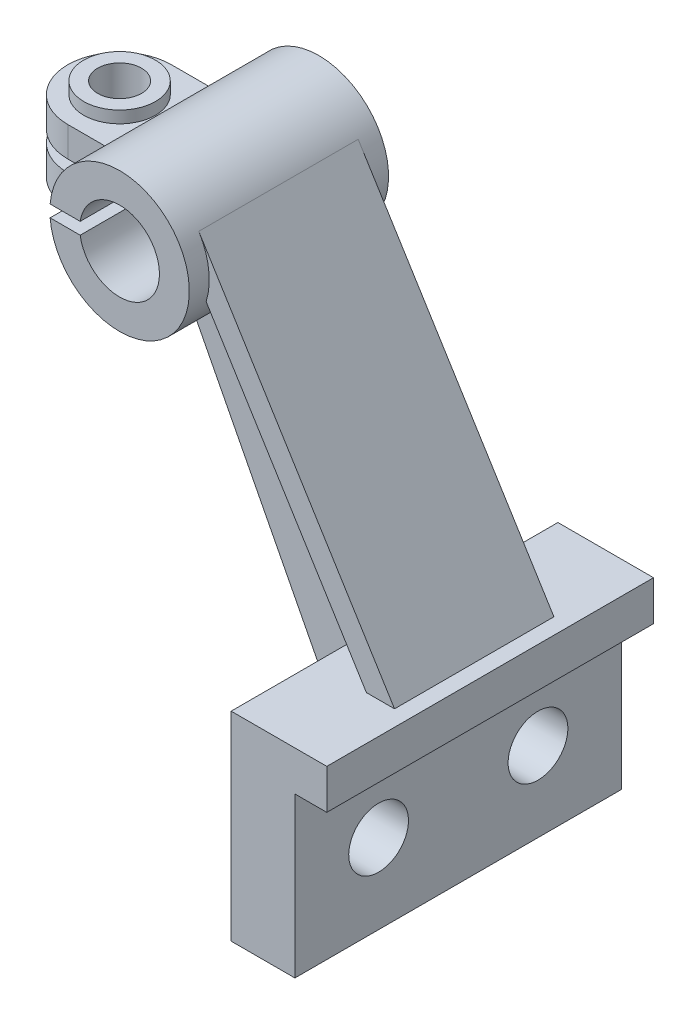
ISO-10303-21;
HEADER;
FILE_DESCRIPTION(('STEP AP214'),'2;1');
FILE_NAME('part.step','',(''),(''),'','','');
FILE_SCHEMA(('AUTOMOTIVE_DESIGN { 1 0 10303 214 1 1 1 1 }'));
ENDSEC;
DATA;
#1=APPLICATION_CONTEXT('core data for automotive mechanical design processes');
#2=APPLICATION_PROTOCOL_DEFINITION('international standard','automotive_design',2000,#1);
#3=PRODUCT_CONTEXT('',#1,'mechanical');
#4=PRODUCT('Part','Part','',(#3));
#5=PRODUCT_RELATED_PRODUCT_CATEGORY('part','',(#4));
#6=PRODUCT_DEFINITION_FORMATION('','',#4);
#7=PRODUCT_DEFINITION_CONTEXT('part definition',#1,'design');
#8=PRODUCT_DEFINITION('design','',#6,#7);
#9=PRODUCT_DEFINITION_SHAPE('','',#8);
#10=(LENGTH_UNIT() NAMED_UNIT(*) SI_UNIT(.MILLI.,.METRE.));
#11=(NAMED_UNIT(*) PLANE_ANGLE_UNIT() SI_UNIT($,.RADIAN.));
#12=(NAMED_UNIT(*) SI_UNIT($,.STERADIAN.) SOLID_ANGLE_UNIT());
#13=UNCERTAINTY_MEASURE_WITH_UNIT(LENGTH_MEASURE(1.E-05),#10,'distance_accuracy_value','');
#14=(GEOMETRIC_REPRESENTATION_CONTEXT(3) GLOBAL_UNCERTAINTY_ASSIGNED_CONTEXT((#13)) GLOBAL_UNIT_ASSIGNED_CONTEXT((#10,
#11,#12)) REPRESENTATION_CONTEXT('',''));
#15=CARTESIAN_POINT('',(0.,0.,0.));
#16=DIRECTION('',(0.,0.,1.));
#17=DIRECTION('',(1.,0.,0.));
#18=AXIS2_PLACEMENT_3D('',#15,#16,#17);
#19=CARTESIAN_POINT('',(0.,0.,4.));
#20=DIRECTION('',(0.,0.,1.));
#21=DIRECTION('',(1.,0.,0.));
#22=AXIS2_PLACEMENT_3D('',#19,#20,#21);
#23=PLANE('',#22);
#24=DIRECTION('',(1.,0.,0.));
#25=VECTOR('',#24,1.);
#26=CARTESIAN_POINT('',(44.,-70.,4.));
#27=LINE('',#26,#25);
#28=CARTESIAN_POINT('',(44.,-70.,4.));
#29=VERTEX_POINT('',#28);
#30=CARTESIAN_POINT('',(56.939992816439,-70.,4.));
#31=VERTEX_POINT('',#30);
#32=EDGE_CURVE('E370',#29,#31,#27,.T.);
#33=ORIENTED_EDGE('',*,*,#32,.T.);
#34=DIRECTION('',(-0.527012564305545,0.84985749220919,0.));
#35=VECTOR('',#34,1.);
#36=CARTESIAN_POINT('',(9.7733611604057,6.06064448951377,4.));
#37=LINE('',#36,#35);
#38=CARTESIAN_POINT('',(16.7251343349884,-5.14974576815132,4.));
#39=VERTEX_POINT('',#38);
#40=EDGE_CURVE('E287',#31,#39,#37,.T.);
#41=ORIENTED_EDGE('',*,*,#40,.T.);
#42=CARTESIAN_POINT('',(0.,0.,4.));
#43=DIRECTION('',(0.,0.,-1.));
#44=DIRECTION('',(1.,0.,0.));
#45=AXIS2_PLACEMENT_3D('',#42,#43,#44);
#46=CIRCLE('',#45,17.5);
#47=CARTESIAN_POINT('',(-7.,-16.0390149323454,4.));
#48=VERTEX_POINT('',#47);
#49=EDGE_CURVE('E360',#39,#48,#46,.T.);
#50=ORIENTED_EDGE('',*,*,#49,.T.);
#51=DIRECTION('',(0.458099254186981,-0.88890104810003,0.));
#52=VECTOR('',#51,1.);
#53=CARTESIAN_POINT('',(-7.,-16.0390149323454,4.));
#54=LINE('',#53,#52);
#55=CARTESIAN_POINT('',(44.,-115.,4.));
#56=VERTEX_POINT('',#55);
#57=EDGE_CURVE('E363',#48,#56,#54,.T.);
#58=ORIENTED_EDGE('',*,*,#57,.T.);
#59=DIRECTION('',(0.,1.,0.));
#60=VECTOR('',#59,1.);
#61=CARTESIAN_POINT('',(44.,-115.,4.));
#62=LINE('',#61,#60);
#63=EDGE_CURVE('E367',#56,#29,#62,.T.);
#64=ORIENTED_EDGE('',*,*,#63,.T.);
#65=EDGE_LOOP('',(#33,#41,#50,#58,#64));
#66=FACE_BOUND('',#65,.T.);
#67=ADVANCED_FACE('F49',(#66),#23,.T.);
#68=CARTESIAN_POINT('',(0.,0.,-4.));
#69=DIRECTION('',(0.,0.,1.));
#70=DIRECTION('',(1.,0.,0.));
#71=AXIS2_PLACEMENT_3D('',#68,#69,#70);
#72=PLANE('',#71);
#73=DIRECTION('',(-0.527012564305545,0.84985749220919,0.));
#74=VECTOR('',#73,1.);
#75=CARTESIAN_POINT('',(9.7733611604057,6.06064448951377,-4.));
#76=LINE('',#75,#74);
#77=CARTESIAN_POINT('',(56.939992816439,-70.,-4.));
#78=VERTEX_POINT('',#77);
#79=CARTESIAN_POINT('',(16.7251343349884,-5.14974576815131,-4.));
#80=VERTEX_POINT('',#79);
#81=EDGE_CURVE('E283',#78,#80,#76,.T.);
#82=ORIENTED_EDGE('',*,*,#81,.F.);
#83=DIRECTION('',(1.,0.,0.));
#84=VECTOR('',#83,1.);
#85=CARTESIAN_POINT('',(44.,-70.,-4.));
#86=LINE('',#85,#84);
#87=CARTESIAN_POINT('',(44.,-70.,-4.));
#88=VERTEX_POINT('',#87);
#89=EDGE_CURVE('E364',#88,#78,#86,.T.);
#90=ORIENTED_EDGE('',*,*,#89,.F.);
#91=DIRECTION('',(0.,1.,0.));
#92=VECTOR('',#91,1.);
#93=CARTESIAN_POINT('',(44.,-115.,-4.));
#94=LINE('',#93,#92);
#95=CARTESIAN_POINT('',(44.,-115.,-4.));
#96=VERTEX_POINT('',#95);
#97=EDGE_CURVE('E379',#96,#88,#94,.T.);
#98=ORIENTED_EDGE('',*,*,#97,.F.);
#99=DIRECTION('',(0.458099254186981,-0.88890104810003,0.));
#100=VECTOR('',#99,1.);
#101=CARTESIAN_POINT('',(-7.,-16.0390149323454,-4.));
#102=LINE('',#101,#100);
#103=CARTESIAN_POINT('',(-7.,-16.0390149323454,-4.));
#104=VERTEX_POINT('',#103);
#105=EDGE_CURVE('E376',#104,#96,#102,.T.);
#106=ORIENTED_EDGE('',*,*,#105,.F.);
#107=CARTESIAN_POINT('',(0.,0.,-4.));
#108=DIRECTION('',(0.,0.,-1.));
#109=DIRECTION('',(1.,0.,0.));
#110=AXIS2_PLACEMENT_3D('',#107,#108,#109);
#111=CIRCLE('',#110,17.5);
#112=EDGE_CURVE('E359',#80,#104,#111,.T.);
#113=ORIENTED_EDGE('',*,*,#112,.F.);
#114=EDGE_LOOP('',(#82,#90,#98,#106,#113));
#115=FACE_BOUND('',#114,.T.);
#116=ADVANCED_FACE('F595',(#115),#72,.F.);
#117=CARTESIAN_POINT('',(44.,-70.,41.));
#118=DIRECTION('',(0.,-1.,0.));
#119=DIRECTION('',(0.,0.,-1.));
#120=AXIS2_PLACEMENT_3D('',#117,#118,#119);
#121=PLANE('',#120);
#122=DIRECTION('',(0.,0.,-1.));
#123=VECTOR('',#122,1.);
#124=CARTESIAN_POINT('',(64.,-70.,4.));
#125=LINE('',#124,#123);
#126=CARTESIAN_POINT('',(64.,-70.,20.));
#127=VERTEX_POINT('',#126);
#128=CARTESIAN_POINT('',(64.,-70.,-20.));
#129=VERTEX_POINT('',#128);
#130=EDGE_CURVE('E230',#127,#129,#125,.T.);
#131=ORIENTED_EDGE('',*,*,#130,.F.);
#132=DIRECTION('',(1.,0.,0.));
#133=VECTOR('',#132,1.);
#134=CARTESIAN_POINT('',(64.,-70.,20.));
#135=LINE('',#134,#133);
#136=CARTESIAN_POINT('',(56.939992816439,-70.,20.));
#137=VERTEX_POINT('',#136);
#138=EDGE_CURVE('E235',#137,#127,#135,.T.);
#139=ORIENTED_EDGE('',*,*,#138,.F.);
#140=DIRECTION('',(0.,0.,-1.));
#141=VECTOR('',#140,1.);
#142=CARTESIAN_POINT('',(56.939992816439,-70.,20.));
#143=LINE('',#142,#141);
#144=EDGE_CURVE('E268',#137,#31,#143,.T.);
#145=ORIENTED_EDGE('',*,*,#144,.T.);
#146=ORIENTED_EDGE('',*,*,#32,.F.);
#147=DIRECTION('',(0.,0.,-1.));
#148=VECTOR('',#147,1.);
#149=CARTESIAN_POINT('',(44.,-70.,41.));
#150=LINE('',#149,#148);
#151=CARTESIAN_POINT('',(44.,-70.,41.));
#152=VERTEX_POINT('',#151);
#153=EDGE_CURVE('E347',#152,#29,#150,.T.);
#154=ORIENTED_EDGE('',*,*,#153,.F.);
#155=DIRECTION('',(-1.,0.,0.));
#156=VECTOR('',#155,1.);
#157=CARTESIAN_POINT('',(44.,-70.,41.));
#158=LINE('',#157,#156);
#159=CARTESIAN_POINT('',(68.,-70.,41.));
#160=VERTEX_POINT('',#159);
#161=EDGE_CURVE('E331',#160,#152,#158,.T.);
#162=ORIENTED_EDGE('',*,*,#161,.F.);
#163=DIRECTION('',(0.,0.,1.));
#164=VECTOR('',#163,1.);
#165=CARTESIAN_POINT('',(68.,-70.,41.));
#166=LINE('',#165,#164);
#167=CARTESIAN_POINT('',(68.,-70.,-41.));
#168=VERTEX_POINT('',#167);
#169=EDGE_CURVE('E303',#168,#160,#166,.T.);
#170=ORIENTED_EDGE('',*,*,#169,.F.);
#171=DIRECTION('',(-1.,0.,0.));
#172=VECTOR('',#171,1.);
#173=CARTESIAN_POINT('',(44.,-70.,-41.));
#174=LINE('',#173,#172);
#175=CARTESIAN_POINT('',(44.,-70.,-41.));
#176=VERTEX_POINT('',#175);
#177=EDGE_CURVE('E324',#168,#176,#174,.T.);
#178=ORIENTED_EDGE('',*,*,#177,.T.);
#179=EDGE_CURVE('E334',#88,#176,#150,.T.);
#180=ORIENTED_EDGE('',*,*,#179,.F.);
#181=ORIENTED_EDGE('',*,*,#89,.T.);
#182=DIRECTION('',(0.,0.,1.));
#183=VECTOR('',#182,1.);
#184=CARTESIAN_POINT('',(56.939992816439,-70.,41.));
#185=LINE('',#184,#183);
#186=CARTESIAN_POINT('',(56.939992816439,-70.,-20.));
#187=VERTEX_POINT('',#186);
#188=EDGE_CURVE('E11',#187,#78,#185,.T.);
#189=ORIENTED_EDGE('',*,*,#188,.F.);
#190=DIRECTION('',(1.,0.,0.));
#191=VECTOR('',#190,1.);
#192=CARTESIAN_POINT('',(64.,-70.,-20.));
#193=LINE('',#192,#191);
#194=EDGE_CURVE('E237',#187,#129,#193,.T.);
#195=ORIENTED_EDGE('',*,*,#194,.T.);
#196=EDGE_LOOP('',(#131,#139,#145,#146,#154,#162,#170,#178,#180,#181,#189,#195));
#197=FACE_BOUND('',#196,.T.);
#198=ADVANCED_FACE('F232',(#197),#121,.F.);
#199=CARTESIAN_POINT('',(0.,9.,-13.));
#200=DIRECTION('',(0.,0.,1.));
#201=DIRECTION('',(1.,0.,0.));
#202=AXIS2_PLACEMENT_3D('',#199,#200,#201);
#203=PLANE('',#202);
#204=DIRECTION('',(0.,-1.,0.));
#205=VECTOR('',#204,1.);
#206=CARTESIAN_POINT('',(-25.,9.,-13.));
#207=LINE('',#206,#205);
#208=CARTESIAN_POINT('',(-25.,-1.5,-13.));
#209=VERTEX_POINT('',#208);
#210=CARTESIAN_POINT('',(-25.,-9.,-13.));
#211=VERTEX_POINT('',#210);
#212=EDGE_CURVE('E497',#209,#211,#207,.T.);
#213=ORIENTED_EDGE('',*,*,#212,.F.);
#214=DIRECTION('',(1.,0.,0.));
#215=VECTOR('',#214,1.);
#216=CARTESIAN_POINT('',(0.,-1.5,-13.));
#217=LINE('',#216,#215);
#218=CARTESIAN_POINT('',(-17.4355957741627,-1.5,-13.));
#219=VERTEX_POINT('',#218);
#220=EDGE_CURVE('E453',#209,#219,#217,.T.);
#221=ORIENTED_EDGE('',*,*,#220,.T.);
#222=CARTESIAN_POINT('',(0.,0.,-13.));
#223=DIRECTION('',(0.,0.,1.));
#224=DIRECTION('',(1.,0.,0.));
#225=AXIS2_PLACEMENT_3D('',#222,#223,#224);
#226=CIRCLE('',#225,17.5);
#227=CARTESIAN_POINT('',(-15.0083310198036,-9.,-13.));
#228=VERTEX_POINT('',#227);
#229=EDGE_CURVE('E519',#219,#228,#226,.T.);
#230=ORIENTED_EDGE('',*,*,#229,.T.);
#231=DIRECTION('',(-1.,0.,0.));
#232=VECTOR('',#231,1.);
#233=CARTESIAN_POINT('',(0.,-9.,-13.));
#234=LINE('',#233,#232);
#235=EDGE_CURVE('E466',#228,#211,#234,.T.);
#236=ORIENTED_EDGE('',*,*,#235,.T.);
#237=EDGE_LOOP('',(#213,#221,#230,#236));
#238=FACE_BOUND('',#237,.T.);
#239=ADVANCED_FACE('F681',(#238),#203,.F.);
#240=CARTESIAN_POINT('',(-25.,9.,0.));
#241=DIRECTION('',(0.,-1.,0.));
#242=DIRECTION('',(0.,0.,-1.));
#243=AXIS2_PLACEMENT_3D('',#240,#241,#242);
#244=CYLINDRICAL_SURFACE('',#243,13.);
#245=DIRECTION('',(0.,-1.,0.));
#246=VECTOR('',#245,1.);
#247=CARTESIAN_POINT('',(-25.,9.,13.));
#248=LINE('',#247,#246);
#249=CARTESIAN_POINT('',(-25.,-1.5,13.));
#250=VERTEX_POINT('',#249);
#251=CARTESIAN_POINT('',(-25.,-9.,13.));
#252=VERTEX_POINT('',#251);
#253=EDGE_CURVE('E482',#250,#252,#248,.T.);
#254=ORIENTED_EDGE('',*,*,#253,.F.);
#255=CARTESIAN_POINT('',(-25.,-1.5,0.));
#256=DIRECTION('',(0.,-1.,0.));
#257=DIRECTION('',(0.,0.,-1.));
#258=AXIS2_PLACEMENT_3D('',#255,#256,#257);
#259=CIRCLE('',#258,13.);
#260=EDGE_CURVE('E449',#250,#209,#259,.T.);
#261=ORIENTED_EDGE('',*,*,#260,.T.);
#262=ORIENTED_EDGE('',*,*,#212,.T.);
#263=CARTESIAN_POINT('',(-25.,-9.,0.));
#264=DIRECTION('',(0.,1.,0.));
#265=DIRECTION('',(0.,0.,1.));
#266=AXIS2_PLACEMENT_3D('',#263,#264,#265);
#267=CIRCLE('',#266,13.);
#268=EDGE_CURVE('E486',#211,#252,#267,.T.);
#269=ORIENTED_EDGE('',*,*,#268,.T.);
#270=EDGE_LOOP('',(#254,#261,#262,#269));
#271=FACE_BOUND('',#270,.T.);
#272=ADVANCED_FACE('F677',(#271),#244,.T.);
#273=CARTESIAN_POINT('',(0.,9.,13.));
#274=DIRECTION('',(0.,0.,-1.));
#275=DIRECTION('',(-1.,0.,0.));
#276=AXIS2_PLACEMENT_3D('',#273,#274,#275);
#277=PLANE('',#276);
#278=CARTESIAN_POINT('',(0.,0.,13.));
#279=DIRECTION('',(0.,0.,-1.));
#280=DIRECTION('',(-1.,0.,0.));
#281=AXIS2_PLACEMENT_3D('',#278,#279,#280);
#282=CIRCLE('',#281,17.5);
#283=CARTESIAN_POINT('',(-15.0083310198036,-9.,13.));
#284=VERTEX_POINT('',#283);
#285=CARTESIAN_POINT('',(-17.4355957741627,-1.5,13.));
#286=VERTEX_POINT('',#285);
#287=EDGE_CURVE('E515',#284,#286,#282,.T.);
#288=ORIENTED_EDGE('',*,*,#287,.T.);
#289=DIRECTION('',(-1.,0.,0.));
#290=VECTOR('',#289,1.);
#291=CARTESIAN_POINT('',(0.,-1.5,13.));
#292=LINE('',#291,#290);
#293=EDGE_CURVE('E532',#286,#250,#292,.T.);
#294=ORIENTED_EDGE('',*,*,#293,.T.);
#295=ORIENTED_EDGE('',*,*,#253,.T.);
#296=DIRECTION('',(1.,0.,0.));
#297=VECTOR('',#296,1.);
#298=CARTESIAN_POINT('',(0.,-9.,13.));
#299=LINE('',#298,#297);
#300=EDGE_CURVE('E475',#252,#284,#299,.T.);
#301=ORIENTED_EDGE('',*,*,#300,.T.);
#302=EDGE_LOOP('',(#288,#294,#295,#301));
#303=FACE_BOUND('',#302,.T.);
#304=ADVANCED_FACE('F673',(#303),#277,.F.);
#305=CARTESIAN_POINT('',(0.,0.,25.));
#306=DIRECTION('',(0.,0.,-1.));
#307=DIRECTION('',(-1.,0.,0.));
#308=AXIS2_PLACEMENT_3D('',#305,#306,#307);
#309=CYLINDRICAL_SURFACE('',#308,17.5);
#310=CARTESIAN_POINT('',(0.,0.,20.));
#311=DIRECTION('',(0.,0.,-1.));
#312=DIRECTION('',(1.,0.,0.));
#313=AXIS2_PLACEMENT_3D('',#310,#311,#312);
#314=CIRCLE('',#313,17.5);
#315=CARTESIAN_POINT('',(14.8725061136608,9.22271987534704,20.));
#316=VERTEX_POINT('',#315);
#317=CARTESIAN_POINT('',(16.7251343349884,-5.14974576815132,20.));
#318=VERTEX_POINT('',#317);
#319=EDGE_CURVE('E248',#316,#318,#314,.T.);
#320=ORIENTED_EDGE('',*,*,#319,.F.);
#321=DIRECTION('',(0.,0.,-1.));
#322=VECTOR('',#321,1.);
#323=CARTESIAN_POINT('',(14.8725061136608,9.22271987534704,4.));
#324=LINE('',#323,#322);
#325=CARTESIAN_POINT('',(14.8725061136608,9.22271987534704,-20.));
#326=VERTEX_POINT('',#325);
#327=EDGE_CURVE('E67',#316,#326,#324,.T.);
#328=ORIENTED_EDGE('',*,*,#327,.T.);
#329=CARTESIAN_POINT('',(0.,0.,-20.));
#330=DIRECTION('',(0.,0.,-1.));
#331=DIRECTION('',(1.,0.,0.));
#332=AXIS2_PLACEMENT_3D('',#329,#330,#331);
#333=CIRCLE('',#332,17.5);
#334=CARTESIAN_POINT('',(16.7251343349884,-5.14974576815131,-20.));
#335=VERTEX_POINT('',#334);
#336=EDGE_CURVE('E72',#326,#335,#333,.T.);
#337=ORIENTED_EDGE('',*,*,#336,.T.);
#338=DIRECTION('',(0.,0.,-1.));
#339=VECTOR('',#338,1.);
#340=CARTESIAN_POINT('',(16.7251343349884,-5.14974576815132,20.));
#341=LINE('',#340,#339);
#342=EDGE_CURVE('E279',#80,#335,#341,.T.);
#343=ORIENTED_EDGE('',*,*,#342,.F.);
#344=ORIENTED_EDGE('',*,*,#112,.T.);
#345=DIRECTION('',(0.,0.,-1.));
#346=VECTOR('',#345,1.);
#347=CARTESIAN_POINT('',(-7.,-16.0390149323454,4.));
#348=LINE('',#347,#346);
#349=EDGE_CURVE('E391',#48,#104,#348,.T.);
#350=ORIENTED_EDGE('',*,*,#349,.F.);
#351=ORIENTED_EDGE('',*,*,#49,.F.);
#352=EDGE_CURVE('E280',#318,#39,#341,.T.);
#353=ORIENTED_EDGE('',*,*,#352,.F.);
#354=EDGE_LOOP('',(#320,#328,#337,#343,#344,#350,#351,#353));
#355=FACE_BOUND('',#354,.T.);
#356=CARTESIAN_POINT('',(0.,0.,25.));
#357=DIRECTION('',(0.,0.,1.));
#358=DIRECTION('',(1.,0.,0.));
#359=AXIS2_PLACEMENT_3D('',#356,#357,#358);
#360=CIRCLE('',#359,17.5);
#361=CARTESIAN_POINT('',(-17.4355957741627,-1.5,25.));
#362=VERTEX_POINT('',#361);
#363=CARTESIAN_POINT('',(-17.4355957741627,1.5,25.));
#364=VERTEX_POINT('',#363);
#365=EDGE_CURVE('E503',#362,#364,#360,.T.);
#366=ORIENTED_EDGE('',*,*,#365,.F.);
#367=DIRECTION('',(0.,0.,-1.));
#368=VECTOR('',#367,1.);
#369=CARTESIAN_POINT('',(-17.4355957741627,-1.5,25.));
#370=LINE('',#369,#368);
#371=EDGE_CURVE('E461',#362,#286,#370,.T.);
#372=ORIENTED_EDGE('',*,*,#371,.T.);
#373=ORIENTED_EDGE('',*,*,#287,.F.);
#374=DIRECTION('',(0.,0.,-1.));
#375=VECTOR('',#374,1.);
#376=CARTESIAN_POINT('',(-15.0083310198036,-9.,25.));
#377=LINE('',#376,#375);
#378=EDGE_CURVE('E507',#228,#284,#377,.F.);
#379=ORIENTED_EDGE('',*,*,#378,.F.);
#380=ORIENTED_EDGE('',*,*,#229,.F.);
#381=CARTESIAN_POINT('',(-17.4355957741627,-1.5,-25.));
#382=VERTEX_POINT('',#381);
#383=EDGE_CURVE('E457',#219,#382,#370,.T.);
#384=ORIENTED_EDGE('',*,*,#383,.T.);
#385=CARTESIAN_POINT('',(0.,0.,-25.));
#386=DIRECTION('',(0.,0.,1.));
#387=DIRECTION('',(1.,0.,0.));
#388=AXIS2_PLACEMENT_3D('',#385,#386,#387);
#389=CIRCLE('',#388,17.5);
#390=CARTESIAN_POINT('',(-17.4355957741627,1.5,-25.));
#391=VERTEX_POINT('',#390);
#392=EDGE_CURVE('E502',#382,#391,#389,.T.);
#393=ORIENTED_EDGE('',*,*,#392,.T.);
#394=DIRECTION('',(0.,0.,-1.));
#395=VECTOR('',#394,1.);
#396=CARTESIAN_POINT('',(-17.4355957741627,1.5,25.));
#397=LINE('',#396,#395);
#398=CARTESIAN_POINT('',(-17.4355957741627,1.5,-13.));
#399=VERTEX_POINT('',#398);
#400=EDGE_CURVE('E448',#391,#399,#397,.F.);
#401=ORIENTED_EDGE('',*,*,#400,.T.);
#402=CARTESIAN_POINT('',(-15.0083310198036,9.,-13.));
#403=VERTEX_POINT('',#402);
#404=EDGE_CURVE('E520',#403,#399,#226,.T.);
#405=ORIENTED_EDGE('',*,*,#404,.F.);
#406=DIRECTION('',(0.,0.,-1.));
#407=VECTOR('',#406,1.);
#408=CARTESIAN_POINT('',(-15.0083310198036,9.,25.));
#409=LINE('',#408,#407);
#410=CARTESIAN_POINT('',(-15.0083310198036,9.,13.));
#411=VERTEX_POINT('',#410);
#412=EDGE_CURVE('E524',#403,#411,#409,.F.);
#413=ORIENTED_EDGE('',*,*,#412,.T.);
#414=CARTESIAN_POINT('',(-17.4355957741627,1.5,13.));
#415=VERTEX_POINT('',#414);
#416=EDGE_CURVE('E514',#415,#411,#282,.T.);
#417=ORIENTED_EDGE('',*,*,#416,.F.);
#418=EDGE_CURVE('E444',#415,#364,#397,.F.);
#419=ORIENTED_EDGE('',*,*,#418,.T.);
#420=EDGE_LOOP('',(#366,#372,#373,#379,#380,#384,#393,#401,#405,#413,#417,#419));
#421=FACE_BOUND('',#420,.T.);
#422=ADVANCED_FACE('F51',(#355,#421),#309,.T.);
#423=CARTESIAN_POINT('',(0.,0.,25.));
#424=DIRECTION('',(0.,0.,1.));
#425=DIRECTION('',(1.,0.,0.));
#426=AXIS2_PLACEMENT_3D('',#423,#424,#425);
#427=PLANE('',#426);
#428=CARTESIAN_POINT('',(0.,0.,25.));
#429=DIRECTION('',(0.,0.,1.));
#430=DIRECTION('',(1.,0.,0.));
#431=AXIS2_PLACEMENT_3D('',#428,#429,#430);
#432=CIRCLE('',#431,10.);
#433=CARTESIAN_POINT('',(-9.88685996664259,-1.5,25.));
#434=VERTEX_POINT('',#433);
#435=CARTESIAN_POINT('',(-9.88685996664259,1.5,25.));
#436=VERTEX_POINT('',#435);
#437=EDGE_CURVE('E415',#434,#436,#432,.T.);
#438=ORIENTED_EDGE('',*,*,#437,.F.);
#439=DIRECTION('',(1.,0.,0.));
#440=VECTOR('',#439,1.);
#441=CARTESIAN_POINT('',(-40.7776288781727,-1.5,25.));
#442=LINE('',#441,#440);
#443=EDGE_CURVE('E425',#362,#434,#442,.T.);
#444=ORIENTED_EDGE('',*,*,#443,.F.);
#445=ORIENTED_EDGE('',*,*,#365,.T.);
#446=DIRECTION('',(-1.,0.,0.));
#447=VECTOR('',#446,1.);
#448=CARTESIAN_POINT('',(-40.7776288781727,1.5,25.));
#449=LINE('',#448,#447);
#450=EDGE_CURVE('E422',#436,#364,#449,.T.);
#451=ORIENTED_EDGE('',*,*,#450,.F.);
#452=EDGE_LOOP('',(#438,#444,#445,#451));
#453=FACE_BOUND('',#452,.T.);
#454=ADVANCED_FACE('F682',(#453),#427,.T.);
#455=CARTESIAN_POINT('',(0.,0.,-25.));
#456=DIRECTION('',(0.,0.,1.));
#457=DIRECTION('',(1.,0.,0.));
#458=AXIS2_PLACEMENT_3D('',#455,#456,#457);
#459=PLANE('',#458);
#460=DIRECTION('',(1.,0.,0.));
#461=VECTOR('',#460,1.);
#462=CARTESIAN_POINT('',(-40.7776288781727,-1.5,-25.));
#463=LINE('',#462,#461);
#464=CARTESIAN_POINT('',(-9.88685996664259,-1.5,-25.));
#465=VERTEX_POINT('',#464);
#466=EDGE_CURVE('E432',#382,#465,#463,.T.);
#467=ORIENTED_EDGE('',*,*,#466,.T.);
#468=CARTESIAN_POINT('',(0.,0.,-25.));
#469=DIRECTION('',(0.,0.,1.));
#470=DIRECTION('',(1.,0.,0.));
#471=AXIS2_PLACEMENT_3D('',#468,#469,#470);
#472=CIRCLE('',#471,10.);
#473=CARTESIAN_POINT('',(-9.88685996664259,1.5,-25.));
#474=VERTEX_POINT('',#473);
#475=EDGE_CURVE('E411',#465,#474,#472,.T.);
#476=ORIENTED_EDGE('',*,*,#475,.T.);
#477=DIRECTION('',(-1.,0.,0.));
#478=VECTOR('',#477,1.);
#479=CARTESIAN_POINT('',(-40.7776288781727,1.5,-25.));
#480=LINE('',#479,#478);
#481=EDGE_CURVE('E429',#474,#391,#480,.T.);
#482=ORIENTED_EDGE('',*,*,#481,.T.);
#483=ORIENTED_EDGE('',*,*,#392,.F.);
#484=EDGE_LOOP('',(#467,#476,#482,#483));
#485=FACE_BOUND('',#484,.T.);
#486=ADVANCED_FACE('F663',(#485),#459,.F.);
#487=CARTESIAN_POINT('',(0.,9.,0.));
#488=DIRECTION('',(0.,1.,0.));
#489=DIRECTION('',(0.,0.,1.));
#490=AXIS2_PLACEMENT_3D('',#487,#488,#489);
#491=PLANE('',#490);
#492=CARTESIAN_POINT('',(-25.,9.,0.));
#493=DIRECTION('',(0.,1.,0.));
#494=DIRECTION('',(0.,0.,1.));
#495=AXIS2_PLACEMENT_3D('',#492,#493,#494);
#496=CIRCLE('',#495,9.);
#497=CARTESIAN_POINT('',(-25.,9.,9.));
#498=VERTEX_POINT('',#497);
#499=EDGE_CURVE('E467',#498,#498,#496,.T.);
#500=ORIENTED_EDGE('',*,*,#499,.F.);
#501=EDGE_LOOP('',(#500));
#502=FACE_BOUND('',#501,.T.);
#503=ORIENTED_EDGE('',*,*,#412,.F.);
#504=DIRECTION('',(-1.,0.,0.));
#505=VECTOR('',#504,1.);
#506=CARTESIAN_POINT('',(0.,9.,-13.));
#507=LINE('',#506,#505);
#508=CARTESIAN_POINT('',(-25.,9.,-13.));
#509=VERTEX_POINT('',#508);
#510=EDGE_CURVE('E471',#403,#509,#507,.T.);
#511=ORIENTED_EDGE('',*,*,#510,.T.);
#512=CARTESIAN_POINT('',(-25.,9.,0.));
#513=DIRECTION('',(0.,1.,0.));
#514=DIRECTION('',(0.,0.,1.));
#515=AXIS2_PLACEMENT_3D('',#512,#513,#514);
#516=CIRCLE('',#515,13.);
#517=CARTESIAN_POINT('',(-25.,9.,13.));
#518=VERTEX_POINT('',#517);
#519=EDGE_CURVE('E474',#509,#518,#516,.T.);
#520=ORIENTED_EDGE('',*,*,#519,.T.);
#521=DIRECTION('',(1.,0.,0.));
#522=VECTOR('',#521,1.);
#523=CARTESIAN_POINT('',(0.,9.,13.));
#524=LINE('',#523,#522);
#525=EDGE_CURVE('E478',#518,#411,#524,.T.);
#526=ORIENTED_EDGE('',*,*,#525,.T.);
#527=EDGE_LOOP('',(#503,#511,#520,#526));
#528=FACE_BOUND('',#527,.T.);
#529=ADVANCED_FACE('F659',(#502,#528),#491,.T.);
#530=CARTESIAN_POINT('',(0.,-9.,0.));
#531=DIRECTION('',(0.,1.,0.));
#532=DIRECTION('',(0.,0.,1.));
#533=AXIS2_PLACEMENT_3D('',#530,#531,#532);
#534=PLANE('',#533);
#535=CARTESIAN_POINT('',(-25.,-9.,0.));
#536=DIRECTION('',(0.,1.,0.));
#537=DIRECTION('',(0.,0.,1.));
#538=AXIS2_PLACEMENT_3D('',#535,#536,#537);
#539=CIRCLE('',#538,4.24999999999999);
#540=CARTESIAN_POINT('',(-25.,-9.,4.24999999999999));
#541=VERTEX_POINT('',#540);
#542=EDGE_CURVE('E399',#541,#541,#539,.T.);
#543=ORIENTED_EDGE('',*,*,#542,.T.);
#544=EDGE_LOOP('',(#543));
#545=FACE_BOUND('',#544,.T.);
#546=ORIENTED_EDGE('',*,*,#235,.F.);
#547=ORIENTED_EDGE('',*,*,#378,.T.);
#548=ORIENTED_EDGE('',*,*,#300,.F.);
#549=ORIENTED_EDGE('',*,*,#268,.F.);
#550=EDGE_LOOP('',(#546,#547,#548,#549));
#551=FACE_BOUND('',#550,.T.);
#552=ADVANCED_FACE('F662',(#545,#551),#534,.F.);
#553=ORIENTED_EDGE('',*,*,#404,.T.);
#554=DIRECTION('',(-1.,0.,0.));
#555=VECTOR('',#554,1.);
#556=CARTESIAN_POINT('',(0.,1.5,-13.));
#557=LINE('',#556,#555);
#558=CARTESIAN_POINT('',(-25.,1.5,-13.));
#559=VERTEX_POINT('',#558);
#560=EDGE_CURVE('E440',#399,#559,#557,.T.);
#561=ORIENTED_EDGE('',*,*,#560,.T.);
#562=EDGE_CURVE('E498',#509,#559,#207,.T.);
#563=ORIENTED_EDGE('',*,*,#562,.F.);
#564=ORIENTED_EDGE('',*,*,#510,.F.);
#565=EDGE_LOOP('',(#553,#561,#563,#564));
#566=FACE_BOUND('',#565,.T.);
#567=ADVANCED_FACE('F667',(#566),#203,.F.);
#568=ORIENTED_EDGE('',*,*,#562,.T.);
#569=CARTESIAN_POINT('',(-25.,1.5,0.));
#570=DIRECTION('',(0.,1.,0.));
#571=DIRECTION('',(0.,0.,1.));
#572=AXIS2_PLACEMENT_3D('',#569,#570,#571);
#573=CIRCLE('',#572,13.);
#574=CARTESIAN_POINT('',(-25.,1.5,13.));
#575=VERTEX_POINT('',#574);
#576=EDGE_CURVE('E436',#559,#575,#573,.T.);
#577=ORIENTED_EDGE('',*,*,#576,.T.);
#578=EDGE_CURVE('E493',#518,#575,#248,.T.);
#579=ORIENTED_EDGE('',*,*,#578,.F.);
#580=ORIENTED_EDGE('',*,*,#519,.F.);
#581=EDGE_LOOP('',(#568,#577,#579,#580));
#582=FACE_BOUND('',#581,.T.);
#583=ADVANCED_FACE('F671',(#582),#244,.T.);
#584=ORIENTED_EDGE('',*,*,#578,.T.);
#585=DIRECTION('',(1.,0.,0.));
#586=VECTOR('',#585,1.);
#587=CARTESIAN_POINT('',(0.,1.5,13.));
#588=LINE('',#587,#586);
#589=EDGE_CURVE('E528',#575,#415,#588,.T.);
#590=ORIENTED_EDGE('',*,*,#589,.T.);
#591=ORIENTED_EDGE('',*,*,#416,.T.);
#592=ORIENTED_EDGE('',*,*,#525,.F.);
#593=EDGE_LOOP('',(#584,#590,#591,#592));
#594=FACE_BOUND('',#593,.T.);
#595=ADVANCED_FACE('F657',(#594),#277,.F.);
#596=CARTESIAN_POINT('',(-25.,12.,0.));
#597=DIRECTION('',(0.,-1.,0.));
#598=DIRECTION('',(0.,0.,-1.));
#599=AXIS2_PLACEMENT_3D('',#596,#597,#598);
#600=CYLINDRICAL_SURFACE('',#599,9.);
#601=CARTESIAN_POINT('',(-25.,12.,0.));
#602=DIRECTION('',(0.,1.,0.));
#603=DIRECTION('',(0.,0.,1.));
#604=AXIS2_PLACEMENT_3D('',#601,#602,#603);
#605=CIRCLE('',#604,9.);
#606=CARTESIAN_POINT('',(-25.,12.,9.));
#607=VERTEX_POINT('',#606);
#608=EDGE_CURVE('E462',#607,#607,#605,.T.);
#609=ORIENTED_EDGE('',*,*,#608,.F.);
#610=EDGE_LOOP('',(#609));
#611=FACE_BOUND('',#610,.T.);
#612=ORIENTED_EDGE('',*,*,#499,.T.);
#613=EDGE_LOOP('',(#612));
#614=FACE_BOUND('',#613,.T.);
#615=ADVANCED_FACE('F653',(#611,#614),#600,.T.);
#616=CARTESIAN_POINT('',(-25.,12.,0.));
#617=DIRECTION('',(0.,1.,0.));
#618=DIRECTION('',(0.,0.,1.));
#619=AXIS2_PLACEMENT_3D('',#616,#617,#618);
#620=PLANE('',#619);
#621=CARTESIAN_POINT('',(-25.,12.,0.));
#622=DIRECTION('',(0.,1.,0.));
#623=DIRECTION('',(0.,0.,1.));
#624=AXIS2_PLACEMENT_3D('',#621,#622,#623);
#625=CIRCLE('',#624,5.5);
#626=CARTESIAN_POINT('',(-25.,12.,5.5));
#627=VERTEX_POINT('',#626);
#628=EDGE_CURVE('E407',#627,#627,#625,.T.);
#629=ORIENTED_EDGE('',*,*,#628,.F.);
#630=EDGE_LOOP('',(#629));
#631=FACE_BOUND('',#630,.T.);
#632=ORIENTED_EDGE('',*,*,#608,.T.);
#633=EDGE_LOOP('',(#632));
#634=FACE_BOUND('',#633,.T.);
#635=ADVANCED_FACE('F646',(#631,#634),#620,.T.);
#636=CARTESIAN_POINT('',(-40.7776288781727,-1.5,-25.));
#637=DIRECTION('',(0.,-1.,0.));
#638=DIRECTION('',(0.,0.,-1.));
#639=AXIS2_PLACEMENT_3D('',#636,#637,#638);
#640=PLANE('',#639);
#641=CARTESIAN_POINT('',(-25.,-1.5,0.));
#642=DIRECTION('',(0.,1.,0.));
#643=DIRECTION('',(0.,0.,1.));
#644=AXIS2_PLACEMENT_3D('',#641,#642,#643);
#645=CIRCLE('',#644,4.24999999999999);
#646=CARTESIAN_POINT('',(-25.,-1.5,4.24999999999999));
#647=VERTEX_POINT('',#646);
#648=EDGE_CURVE('E395',#647,#647,#645,.T.);
#649=ORIENTED_EDGE('',*,*,#648,.F.);
#650=EDGE_LOOP('',(#649));
#651=FACE_BOUND('',#650,.T.);
#652=ORIENTED_EDGE('',*,*,#443,.T.);
#653=DIRECTION('',(0.,0.,1.));
#654=VECTOR('',#653,1.);
#655=CARTESIAN_POINT('',(-9.88685996664259,-1.5,-25.));
#656=LINE('',#655,#654);
#657=EDGE_CURVE('E418',#434,#465,#656,.F.);
#658=ORIENTED_EDGE('',*,*,#657,.T.);
#659=ORIENTED_EDGE('',*,*,#466,.F.);
#660=ORIENTED_EDGE('',*,*,#383,.F.);
#661=ORIENTED_EDGE('',*,*,#220,.F.);
#662=ORIENTED_EDGE('',*,*,#260,.F.);
#663=ORIENTED_EDGE('',*,*,#293,.F.);
#664=ORIENTED_EDGE('',*,*,#371,.F.);
#665=EDGE_LOOP('',(#652,#658,#659,#660,#661,#662,#663,#664));
#666=FACE_BOUND('',#665,.T.);
#667=ADVANCED_FACE('F643',(#651,#666),#640,.F.);
#668=CARTESIAN_POINT('',(-40.7776288781727,1.5,-25.));
#669=DIRECTION('',(0.,1.,0.));
#670=DIRECTION('',(0.,0.,1.));
#671=AXIS2_PLACEMENT_3D('',#668,#669,#670);
#672=PLANE('',#671);
#673=CARTESIAN_POINT('',(-25.,1.5,0.));
#674=DIRECTION('',(0.,1.,0.));
#675=DIRECTION('',(0.,0.,1.));
#676=AXIS2_PLACEMENT_3D('',#673,#674,#675);
#677=CIRCLE('',#676,5.5);
#678=CARTESIAN_POINT('',(-25.,1.5,5.5));
#679=VERTEX_POINT('',#678);
#680=EDGE_CURVE('E403',#679,#679,#677,.F.);
#681=ORIENTED_EDGE('',*,*,#680,.F.);
#682=EDGE_LOOP('',(#681));
#683=FACE_BOUND('',#682,.T.);
#684=ORIENTED_EDGE('',*,*,#481,.F.);
#685=DIRECTION('',(0.,0.,1.));
#686=VECTOR('',#685,1.);
#687=CARTESIAN_POINT('',(-9.88685996664259,1.5,-25.));
#688=LINE('',#687,#686);
#689=EDGE_CURVE('E59',#474,#436,#688,.T.);
#690=ORIENTED_EDGE('',*,*,#689,.T.);
#691=ORIENTED_EDGE('',*,*,#450,.T.);
#692=ORIENTED_EDGE('',*,*,#418,.F.);
#693=ORIENTED_EDGE('',*,*,#589,.F.);
#694=ORIENTED_EDGE('',*,*,#576,.F.);
#695=ORIENTED_EDGE('',*,*,#560,.F.);
#696=ORIENTED_EDGE('',*,*,#400,.F.);
#697=EDGE_LOOP('',(#684,#690,#691,#692,#693,#694,#695,#696));
#698=FACE_BOUND('',#697,.T.);
#699=ADVANCED_FACE('F641',(#683,#698),#672,.F.);
#700=CARTESIAN_POINT('',(0.,0.,-25.));
#701=DIRECTION('',(0.,0.,1.));
#702=DIRECTION('',(1.,0.,0.));
#703=AXIS2_PLACEMENT_3D('',#700,#701,#702);
#704=CYLINDRICAL_SURFACE('',#703,10.);
#705=ORIENTED_EDGE('',*,*,#437,.T.);
#706=ORIENTED_EDGE('',*,*,#689,.F.);
#707=ORIENTED_EDGE('',*,*,#475,.F.);
#708=ORIENTED_EDGE('',*,*,#657,.F.);
#709=EDGE_LOOP('',(#705,#706,#707,#708));
#710=FACE_BOUND('',#709,.T.);
#711=ADVANCED_FACE('F637',(#710),#704,.F.);
#712=CARTESIAN_POINT('',(-25.,-17.501,0.));
#713=DIRECTION('',(0.,1.,0.));
#714=DIRECTION('',(0.,0.,1.));
#715=AXIS2_PLACEMENT_3D('',#712,#713,#714);
#716=CYLINDRICAL_SURFACE('',#715,5.5);
#717=ORIENTED_EDGE('',*,*,#628,.T.);
#718=EDGE_LOOP('',(#717));
#719=FACE_BOUND('',#718,.T.);
#720=ORIENTED_EDGE('',*,*,#680,.T.);
#721=EDGE_LOOP('',(#720));
#722=FACE_BOUND('',#721,.T.);
#723=ADVANCED_FACE('F633',(#719,#722),#716,.F.);
#724=CARTESIAN_POINT('',(-25.,-1.5,0.));
#725=DIRECTION('',(0.,1.,0.));
#726=DIRECTION('',(0.,0.,1.));
#727=AXIS2_PLACEMENT_3D('',#724,#725,#726);
#728=CYLINDRICAL_SURFACE('',#727,4.24999999999999);
#729=ORIENTED_EDGE('',*,*,#542,.F.);
#730=EDGE_LOOP('',(#729));
#731=FACE_BOUND('',#730,.T.);
#732=ORIENTED_EDGE('',*,*,#648,.T.);
#733=EDGE_LOOP('',(#732));
#734=FACE_BOUND('',#733,.T.);
#735=ADVANCED_FACE('F630',(#731,#734),#728,.F.);
#736=CARTESIAN_POINT('',(-7.,-16.0390149323454,4.));
#737=DIRECTION('',(0.88890104810003,0.458099254186981,0.));
#738=DIRECTION('',(-0.458099254186981,0.88890104810003,0.));
#739=AXIS2_PLACEMENT_3D('',#736,#737,#738);
#740=PLANE('',#739);
#741=ORIENTED_EDGE('',*,*,#105,.T.);
#742=DIRECTION('',(0.,0.,-1.));
#743=VECTOR('',#742,1.);
#744=CARTESIAN_POINT('',(44.,-115.,4.));
#745=LINE('',#744,#743);
#746=EDGE_CURVE('E241',#56,#96,#745,.T.);
#747=ORIENTED_EDGE('',*,*,#746,.F.);
#748=ORIENTED_EDGE('',*,*,#57,.F.);
#749=ORIENTED_EDGE('',*,*,#349,.T.);
#750=EDGE_LOOP('',(#741,#747,#748,#749));
#751=FACE_BOUND('',#750,.T.);
#752=ADVANCED_FACE('F592',(#751),#740,.F.);
#753=CARTESIAN_POINT('',(14.8725061136608,9.22271987534704,4.));
#754=DIRECTION('',(-0.84985749220919,-0.527012564305545,0.));
#755=DIRECTION('',(0.527012564305545,-0.84985749220919,0.));
#756=AXIS2_PLACEMENT_3D('',#753,#754,#755);
#757=PLANE('',#756);
#758=ORIENTED_EDGE('',*,*,#130,.T.);
#759=DIRECTION('',(-0.527012564305545,0.84985749220919,0.));
#760=VECTOR('',#759,1.);
#761=CARTESIAN_POINT('',(64.,-70.,-20.));
#762=LINE('',#761,#760);
#763=EDGE_CURVE('E271',#129,#326,#762,.T.);
#764=ORIENTED_EDGE('',*,*,#763,.T.);
#765=ORIENTED_EDGE('',*,*,#327,.F.);
#766=DIRECTION('',(-0.527012564305545,0.84985749220919,0.));
#767=VECTOR('',#766,1.);
#768=CARTESIAN_POINT('',(64.,-70.,20.));
#769=LINE('',#768,#767);
#770=EDGE_CURVE('E244',#127,#316,#769,.T.);
#771=ORIENTED_EDGE('',*,*,#770,.F.);
#772=EDGE_LOOP('',(#758,#764,#765,#771));
#773=FACE_BOUND('',#772,.T.);
#774=ADVANCED_FACE('F245',(#773),#757,.F.);
#775=CARTESIAN_POINT('',(60.,-70.,41.));
#776=DIRECTION('',(-1.,0.,0.));
#777=DIRECTION('',(0.,-1.,0.));
#778=AXIS2_PLACEMENT_3D('',#775,#776,#777);
#779=PLANE('',#778);
#780=CARTESIAN_POINT('',(60.,-100.,20.));
#781=DIRECTION('',(-1.,0.,0.));
#782=DIRECTION('',(0.,-1.,0.));
#783=AXIS2_PLACEMENT_3D('',#780,#781,#782);
#784=CIRCLE('',#783,7.5);
#785=CARTESIAN_POINT('',(60.,-107.5,20.));
#786=VERTEX_POINT('',#785);
#787=EDGE_CURVE('E53',#786,#786,#784,.F.);
#788=ORIENTED_EDGE('',*,*,#787,.F.);
#789=EDGE_LOOP('',(#788));
#790=FACE_BOUND('',#789,.T.);
#791=CARTESIAN_POINT('',(60.,-100.,-20.));
#792=DIRECTION('',(-1.,0.,0.));
#793=DIRECTION('',(0.,-1.,0.));
#794=AXIS2_PLACEMENT_3D('',#791,#792,#793);
#795=CIRCLE('',#794,7.5);
#796=CARTESIAN_POINT('',(60.,-107.5,-20.));
#797=VERTEX_POINT('',#796);
#798=EDGE_CURVE('E538',#797,#797,#795,.T.);
#799=ORIENTED_EDGE('',*,*,#798,.T.);
#800=EDGE_LOOP('',(#799));
#801=FACE_BOUND('',#800,.T.);
#802=DIRECTION('',(0.,0.,-1.));
#803=VECTOR('',#802,1.);
#804=CARTESIAN_POINT('',(60.,-80.,41.));
#805=LINE('',#804,#803);
#806=CARTESIAN_POINT('',(60.,-80.,41.));
#807=VERTEX_POINT('',#806);
#808=CARTESIAN_POINT('',(60.,-80.,-41.));
#809=VERTEX_POINT('',#808);
#810=EDGE_CURVE('E291',#807,#809,#805,.T.);
#811=ORIENTED_EDGE('',*,*,#810,.F.);
#812=DIRECTION('',(0.,1.,0.));
#813=VECTOR('',#812,1.);
#814=CARTESIAN_POINT('',(60.,-70.,41.));
#815=LINE('',#814,#813);
#816=CARTESIAN_POINT('',(60.,-120.,41.));
#817=VERTEX_POINT('',#816);
#818=EDGE_CURVE('E327',#817,#807,#815,.T.);
#819=ORIENTED_EDGE('',*,*,#818,.F.);
#820=DIRECTION('',(0.,0.,-1.));
#821=VECTOR('',#820,1.);
#822=CARTESIAN_POINT('',(60.,-120.,41.));
#823=LINE('',#822,#821);
#824=CARTESIAN_POINT('',(60.,-120.,-41.));
#825=VERTEX_POINT('',#824);
#826=EDGE_CURVE('E351',#817,#825,#823,.T.);
#827=ORIENTED_EDGE('',*,*,#826,.T.);
#828=DIRECTION('',(0.,1.,0.));
#829=VECTOR('',#828,1.);
#830=CARTESIAN_POINT('',(60.,-70.,-41.));
#831=LINE('',#830,#829);
#832=EDGE_CURVE('E341',#825,#809,#831,.T.);
#833=ORIENTED_EDGE('',*,*,#832,.T.);
#834=EDGE_LOOP('',(#811,#819,#827,#833));
#835=FACE_BOUND('',#834,.T.);
#836=ADVANCED_FACE('F573',(#790,#801,#835),#779,.F.);
#837=CARTESIAN_POINT('',(44.,-70.,41.));
#838=DIRECTION('',(1.,0.,0.));
#839=DIRECTION('',(0.,1.,0.));
#840=AXIS2_PLACEMENT_3D('',#837,#838,#839);
#841=PLANE('',#840);
#842=CARTESIAN_POINT('',(44.,-100.,20.));
#843=DIRECTION('',(1.,0.,0.));
#844=DIRECTION('',(0.,-1.,0.));
#845=AXIS2_PLACEMENT_3D('',#842,#843,#844);
#846=CIRCLE('',#845,14.);
#847=CARTESIAN_POINT('',(44.,-114.,20.));
#848=VERTEX_POINT('',#847);
#849=EDGE_CURVE('E554',#848,#848,#846,.T.);
#850=ORIENTED_EDGE('',*,*,#849,.T.);
#851=EDGE_LOOP('',(#850));
#852=FACE_BOUND('',#851,.T.);
#853=CARTESIAN_POINT('',(44.,-100.,-20.));
#854=DIRECTION('',(-1.,0.,0.));
#855=DIRECTION('',(0.,-1.,0.));
#856=AXIS2_PLACEMENT_3D('',#853,#854,#855);
#857=CIRCLE('',#856,14.);
#858=CARTESIAN_POINT('',(44.,-114.,-20.));
#859=VERTEX_POINT('',#858);
#860=EDGE_CURVE('E261',#859,#859,#857,.T.);
#861=ORIENTED_EDGE('',*,*,#860,.F.);
#862=EDGE_LOOP('',(#861));
#863=FACE_BOUND('',#862,.T.);
#864=ORIENTED_EDGE('',*,*,#63,.F.);
#865=ORIENTED_EDGE('',*,*,#746,.T.);
#866=ORIENTED_EDGE('',*,*,#97,.T.);
#867=ORIENTED_EDGE('',*,*,#179,.T.);
#868=DIRECTION('',(0.,-1.,0.));
#869=VECTOR('',#868,1.);
#870=CARTESIAN_POINT('',(44.,-70.,-41.));
#871=LINE('',#870,#869);
#872=CARTESIAN_POINT('',(44.,-120.,-41.));
#873=VERTEX_POINT('',#872);
#874=EDGE_CURVE('E318',#176,#873,#871,.T.);
#875=ORIENTED_EDGE('',*,*,#874,.T.);
#876=DIRECTION('',(0.,0.,-1.));
#877=VECTOR('',#876,1.);
#878=CARTESIAN_POINT('',(44.,-120.,41.));
#879=LINE('',#878,#877);
#880=CARTESIAN_POINT('',(44.,-120.,41.));
#881=VERTEX_POINT('',#880);
#882=EDGE_CURVE('E355',#881,#873,#879,.T.);
#883=ORIENTED_EDGE('',*,*,#882,.F.);
#884=DIRECTION('',(0.,-1.,0.));
#885=VECTOR('',#884,1.);
#886=CARTESIAN_POINT('',(44.,-70.,41.));
#887=LINE('',#886,#885);
#888=EDGE_CURVE('E319',#152,#881,#887,.T.);
#889=ORIENTED_EDGE('',*,*,#888,.F.);
#890=ORIENTED_EDGE('',*,*,#153,.T.);
#891=EDGE_LOOP('',(#864,#865,#866,#867,#875,#883,#889,#890));
#892=FACE_BOUND('',#891,.T.);
#893=ADVANCED_FACE('F569',(#852,#863,#892),#841,.F.);
#894=CARTESIAN_POINT('',(44.,-120.,41.));
#895=DIRECTION('',(0.,1.,0.));
#896=DIRECTION('',(0.,0.,1.));
#897=AXIS2_PLACEMENT_3D('',#894,#895,#896);
#898=PLANE('',#897);
#899=DIRECTION('',(1.,0.,0.));
#900=VECTOR('',#899,1.);
#901=CARTESIAN_POINT('',(44.,-120.,-41.));
#902=LINE('',#901,#900);
#903=EDGE_CURVE('E338',#873,#825,#902,.T.);
#904=ORIENTED_EDGE('',*,*,#903,.T.);
#905=ORIENTED_EDGE('',*,*,#826,.F.);
#906=DIRECTION('',(1.,0.,0.));
#907=VECTOR('',#906,1.);
#908=CARTESIAN_POINT('',(44.,-120.,41.));
#909=LINE('',#908,#907);
#910=EDGE_CURVE('E323',#881,#817,#909,.T.);
#911=ORIENTED_EDGE('',*,*,#910,.F.);
#912=ORIENTED_EDGE('',*,*,#882,.T.);
#913=EDGE_LOOP('',(#904,#905,#911,#912));
#914=FACE_BOUND('',#913,.T.);
#915=ADVANCED_FACE('F572',(#914),#898,.F.);
#916=CARTESIAN_POINT('',(0.,0.,41.));
#917=DIRECTION('',(0.,0.,1.));
#918=DIRECTION('',(1.,0.,0.));
#919=AXIS2_PLACEMENT_3D('',#916,#917,#918);
#920=PLANE('',#919);
#921=ORIENTED_EDGE('',*,*,#888,.T.);
#922=ORIENTED_EDGE('',*,*,#910,.T.);
#923=ORIENTED_EDGE('',*,*,#818,.T.);
#924=DIRECTION('',(-1.,0.,0.));
#925=VECTOR('',#924,1.);
#926=CARTESIAN_POINT('',(68.,-80.,41.));
#927=LINE('',#926,#925);
#928=CARTESIAN_POINT('',(68.,-80.,41.));
#929=VERTEX_POINT('',#928);
#930=EDGE_CURVE('E314',#929,#807,#927,.T.);
#931=ORIENTED_EDGE('',*,*,#930,.F.);
#932=DIRECTION('',(0.,-1.,0.));
#933=VECTOR('',#932,1.);
#934=CARTESIAN_POINT('',(68.,-70.,41.));
#935=LINE('',#934,#933);
#936=EDGE_CURVE('E292',#160,#929,#935,.T.);
#937=ORIENTED_EDGE('',*,*,#936,.F.);
#938=ORIENTED_EDGE('',*,*,#161,.T.);
#939=EDGE_LOOP('',(#921,#922,#923,#931,#937,#938));
#940=FACE_BOUND('',#939,.T.);
#941=ADVANCED_FACE('F744',(#940),#920,.T.);
#942=CARTESIAN_POINT('',(0.,0.,-41.));
#943=DIRECTION('',(0.,0.,1.));
#944=DIRECTION('',(1.,0.,0.));
#945=AXIS2_PLACEMENT_3D('',#942,#943,#944);
#946=PLANE('',#945);
#947=ORIENTED_EDGE('',*,*,#874,.F.);
#948=ORIENTED_EDGE('',*,*,#177,.F.);
#949=DIRECTION('',(0.,1.,0.));
#950=VECTOR('',#949,1.);
#951=CARTESIAN_POINT('',(68.,-70.,-41.));
#952=LINE('',#951,#950);
#953=CARTESIAN_POINT('',(68.,-80.,-41.));
#954=VERTEX_POINT('',#953);
#955=EDGE_CURVE('E299',#954,#168,#952,.T.);
#956=ORIENTED_EDGE('',*,*,#955,.F.);
#957=DIRECTION('',(-1.,0.,0.));
#958=VECTOR('',#957,1.);
#959=CARTESIAN_POINT('',(68.,-80.,-41.));
#960=LINE('',#959,#958);
#961=EDGE_CURVE('E307',#954,#809,#960,.T.);
#962=ORIENTED_EDGE('',*,*,#961,.T.);
#963=ORIENTED_EDGE('',*,*,#832,.F.);
#964=ORIENTED_EDGE('',*,*,#903,.F.);
#965=EDGE_LOOP('',(#947,#948,#956,#962,#963,#964));
#966=FACE_BOUND('',#965,.T.);
#967=ADVANCED_FACE('F739',(#966),#946,.F.);
#968=CARTESIAN_POINT('',(68.,-80.,41.));
#969=DIRECTION('',(0.,1.,0.));
#970=DIRECTION('',(-1.,0.,0.));
#971=AXIS2_PLACEMENT_3D('',#968,#969,#970);
#972=PLANE('',#971);
#973=ORIENTED_EDGE('',*,*,#810,.T.);
#974=ORIENTED_EDGE('',*,*,#961,.F.);
#975=DIRECTION('',(0.,0.,-1.));
#976=VECTOR('',#975,1.);
#977=CARTESIAN_POINT('',(68.,-80.,41.));
#978=LINE('',#977,#976);
#979=EDGE_CURVE('E296',#929,#954,#978,.T.);
#980=ORIENTED_EDGE('',*,*,#979,.F.);
#981=ORIENTED_EDGE('',*,*,#930,.T.);
#982=EDGE_LOOP('',(#973,#974,#980,#981));
#983=FACE_BOUND('',#982,.T.);
#984=ADVANCED_FACE('F615',(#983),#972,.F.);
#985=CARTESIAN_POINT('',(68.,0.,0.));
#986=DIRECTION('',(1.,0.,0.));
#987=DIRECTION('',(0.,1.,0.));
#988=AXIS2_PLACEMENT_3D('',#985,#986,#987);
#989=PLANE('',#988);
#990=ORIENTED_EDGE('',*,*,#936,.T.);
#991=ORIENTED_EDGE('',*,*,#979,.T.);
#992=ORIENTED_EDGE('',*,*,#955,.T.);
#993=ORIENTED_EDGE('',*,*,#169,.T.);
#994=EDGE_LOOP('',(#990,#991,#992,#993));
#995=FACE_BOUND('',#994,.T.);
#996=ADVANCED_FACE('F607',(#995),#989,.T.);
#997=CARTESIAN_POINT('',(0.,0.,-20.));
#998=DIRECTION('',(0.,0.,1.));
#999=DIRECTION('',(1.,0.,0.));
#1000=AXIS2_PLACEMENT_3D('',#997,#998,#999);
#1001=PLANE('',#1000);
#1002=ORIENTED_EDGE('',*,*,#194,.F.);
#1003=DIRECTION('',(0.527012564305545,-0.84985749220919,0.));
#1004=VECTOR('',#1003,1.);
#1005=CARTESIAN_POINT('',(56.939992816439,-70.,-20.));
#1006=LINE('',#1005,#1004);
#1007=EDGE_CURVE('E255',#335,#187,#1006,.T.);
#1008=ORIENTED_EDGE('',*,*,#1007,.F.);
#1009=ORIENTED_EDGE('',*,*,#336,.F.);
#1010=ORIENTED_EDGE('',*,*,#763,.F.);
#1011=EDGE_LOOP('',(#1002,#1008,#1009,#1010));
#1012=FACE_BOUND('',#1011,.T.);
#1013=ADVANCED_FACE('F605',(#1012),#1001,.F.);
#1014=CARTESIAN_POINT('',(56.939992816439,-70.,20.));
#1015=DIRECTION('',(0.84985749220919,0.527012564305545,0.));
#1016=DIRECTION('',(-0.527012564305545,0.84985749220919,0.));
#1017=AXIS2_PLACEMENT_3D('',#1014,#1015,#1016);
#1018=PLANE('',#1017);
#1019=ORIENTED_EDGE('',*,*,#188,.T.);
#1020=ORIENTED_EDGE('',*,*,#81,.T.);
#1021=ORIENTED_EDGE('',*,*,#342,.T.);
#1022=ORIENTED_EDGE('',*,*,#1007,.T.);
#1023=EDGE_LOOP('',(#1019,#1020,#1021,#1022));
#1024=FACE_BOUND('',#1023,.T.);
#1025=ADVANCED_FACE('F603',(#1024),#1018,.F.);
#1026=ORIENTED_EDGE('',*,*,#40,.F.);
#1027=ORIENTED_EDGE('',*,*,#144,.F.);
#1028=DIRECTION('',(0.527012564305545,-0.84985749220919,0.));
#1029=VECTOR('',#1028,1.);
#1030=CARTESIAN_POINT('',(56.939992816439,-70.,20.));
#1031=LINE('',#1030,#1029);
#1032=EDGE_CURVE('E253',#318,#137,#1031,.T.);
#1033=ORIENTED_EDGE('',*,*,#1032,.F.);
#1034=ORIENTED_EDGE('',*,*,#352,.T.);
#1035=EDGE_LOOP('',(#1026,#1027,#1033,#1034));
#1036=FACE_BOUND('',#1035,.T.);
#1037=ADVANCED_FACE('F584',(#1036),#1018,.F.);
#1038=CARTESIAN_POINT('',(0.,0.,20.));
#1039=DIRECTION('',(0.,0.,1.));
#1040=DIRECTION('',(1.,0.,0.));
#1041=AXIS2_PLACEMENT_3D('',#1038,#1039,#1040);
#1042=PLANE('',#1041);
#1043=ORIENTED_EDGE('',*,*,#138,.T.);
#1044=ORIENTED_EDGE('',*,*,#770,.T.);
#1045=ORIENTED_EDGE('',*,*,#319,.T.);
#1046=ORIENTED_EDGE('',*,*,#1032,.T.);
#1047=EDGE_LOOP('',(#1043,#1044,#1045,#1046));
#1048=FACE_BOUND('',#1047,.T.);
#1049=ADVANCED_FACE('F251',(#1048),#1042,.T.);
#1050=CARTESIAN_POINT('',(47.,-100.,-20.));
#1051=DIRECTION('',(-1.,0.,0.));
#1052=DIRECTION('',(0.,-1.,0.));
#1053=AXIS2_PLACEMENT_3D('',#1050,#1051,#1052);
#1054=CYLINDRICAL_SURFACE('',#1053,14.);
#1055=CARTESIAN_POINT('',(47.,-100.,-20.));
#1056=DIRECTION('',(-1.,0.,0.));
#1057=DIRECTION('',(0.,-1.,0.));
#1058=AXIS2_PLACEMENT_3D('',#1055,#1056,#1057);
#1059=CIRCLE('',#1058,14.);
#1060=CARTESIAN_POINT('',(47.,-114.,-20.));
#1061=VERTEX_POINT('',#1060);
#1062=EDGE_CURVE('E272',#1061,#1061,#1059,.T.);
#1063=ORIENTED_EDGE('',*,*,#1062,.F.);
#1064=EDGE_LOOP('',(#1063));
#1065=FACE_BOUND('',#1064,.T.);
#1066=ORIENTED_EDGE('',*,*,#860,.T.);
#1067=EDGE_LOOP('',(#1066));
#1068=FACE_BOUND('',#1067,.T.);
#1069=ADVANCED_FACE('F563',(#1065,#1068),#1054,.F.);
#1070=CARTESIAN_POINT('',(47.,-100.,-20.));
#1071=DIRECTION('',(-1.,0.,0.));
#1072=DIRECTION('',(0.,-1.,0.));
#1073=AXIS2_PLACEMENT_3D('',#1070,#1071,#1072);
#1074=PLANE('',#1073);
#1075=CARTESIAN_POINT('',(47.,-100.,-20.));
#1076=DIRECTION('',(-1.,0.,0.));
#1077=DIRECTION('',(0.,-1.,0.));
#1078=AXIS2_PLACEMENT_3D('',#1075,#1076,#1077);
#1079=CIRCLE('',#1078,7.5);
#1080=CARTESIAN_POINT('',(47.,-107.5,-20.));
#1081=VERTEX_POINT('',#1080);
#1082=EDGE_CURVE('E541',#1081,#1081,#1079,.T.);
#1083=ORIENTED_EDGE('',*,*,#1082,.F.);
#1084=EDGE_LOOP('',(#1083));
#1085=FACE_BOUND('',#1084,.T.);
#1086=ORIENTED_EDGE('',*,*,#1062,.T.);
#1087=EDGE_LOOP('',(#1086));
#1088=FACE_BOUND('',#1087,.T.);
#1089=ADVANCED_FACE('F561',(#1085,#1088),#1074,.T.);
#1090=CARTESIAN_POINT('',(68.,-100.,-20.));
#1091=DIRECTION('',(-1.,0.,0.));
#1092=DIRECTION('',(0.,-1.,0.));
#1093=AXIS2_PLACEMENT_3D('',#1090,#1091,#1092);
#1094=CYLINDRICAL_SURFACE('',#1093,7.5);
#1095=ORIENTED_EDGE('',*,*,#1082,.T.);
#1096=EDGE_LOOP('',(#1095));
#1097=FACE_BOUND('',#1096,.T.);
#1098=ORIENTED_EDGE('',*,*,#798,.F.);
#1099=EDGE_LOOP('',(#1098));
#1100=FACE_BOUND('',#1099,.T.);
#1101=ADVANCED_FACE('F775',(#1097,#1100),#1094,.F.);
#1102=CARTESIAN_POINT('',(47.,-100.,20.));
#1103=DIRECTION('',(-1.,0.,0.));
#1104=DIRECTION('',(0.,-1.,0.));
#1105=AXIS2_PLACEMENT_3D('',#1102,#1103,#1104);
#1106=CYLINDRICAL_SURFACE('',#1105,14.);
#1107=CARTESIAN_POINT('',(47.,-100.,20.));
#1108=DIRECTION('',(1.,0.,0.));
#1109=DIRECTION('',(0.,-1.,0.));
#1110=AXIS2_PLACEMENT_3D('',#1107,#1108,#1109);
#1111=CIRCLE('',#1110,14.);
#1112=CARTESIAN_POINT('',(47.,-114.,20.));
#1113=VERTEX_POINT('',#1112);
#1114=EDGE_CURVE('E548',#1113,#1113,#1111,.T.);
#1115=ORIENTED_EDGE('',*,*,#1114,.T.);
#1116=EDGE_LOOP('',(#1115));
#1117=FACE_BOUND('',#1116,.T.);
#1118=ORIENTED_EDGE('',*,*,#849,.F.);
#1119=EDGE_LOOP('',(#1118));
#1120=FACE_BOUND('',#1119,.T.);
#1121=ADVANCED_FACE('F779',(#1117,#1120),#1106,.F.);
#1122=CARTESIAN_POINT('',(47.,-100.,20.));
#1123=DIRECTION('',(-1.,0.,0.));
#1124=DIRECTION('',(0.,-1.,0.));
#1125=AXIS2_PLACEMENT_3D('',#1122,#1123,#1124);
#1126=PLANE('',#1125);
#1127=CARTESIAN_POINT('',(47.,-100.,20.));
#1128=DIRECTION('',(1.,0.,0.));
#1129=DIRECTION('',(0.,-1.,0.));
#1130=AXIS2_PLACEMENT_3D('',#1127,#1128,#1129);
#1131=CIRCLE('',#1130,7.5);
#1132=CARTESIAN_POINT('',(47.,-107.5,20.));
#1133=VERTEX_POINT('',#1132);
#1134=EDGE_CURVE('E795',#1133,#1133,#1131,.T.);
#1135=ORIENTED_EDGE('',*,*,#1134,.T.);
#1136=EDGE_LOOP('',(#1135));
#1137=FACE_BOUND('',#1136,.T.);
#1138=ORIENTED_EDGE('',*,*,#1114,.F.);
#1139=EDGE_LOOP('',(#1138));
#1140=FACE_BOUND('',#1139,.T.);
#1141=ADVANCED_FACE('F782',(#1137,#1140),#1126,.T.);
#1142=CARTESIAN_POINT('',(68.,-100.,20.));
#1143=DIRECTION('',(-1.,0.,0.));
#1144=DIRECTION('',(0.,-1.,0.));
#1145=AXIS2_PLACEMENT_3D('',#1142,#1143,#1144);
#1146=CYLINDRICAL_SURFACE('',#1145,7.5);
#1147=ORIENTED_EDGE('',*,*,#1134,.F.);
#1148=EDGE_LOOP('',(#1147));
#1149=FACE_BOUND('',#1148,.T.);
#1150=ORIENTED_EDGE('',*,*,#787,.T.);
#1151=EDGE_LOOP('',(#1150));
#1152=FACE_BOUND('',#1151,.T.);
#1153=ADVANCED_FACE('F786',(#1149,#1152),#1146,.F.);
#1154=CLOSED_SHELL('',(#67,#116,#198,#239,#272,#304,#422,#454,#486,#529,#552,#567,#583,#595,
#615,#635,#667,#699,#711,#723,#735,#752,#774,#836,#893,#915,#941,#967,#984,#996,#1013,#1025,
#1037,#1049,#1069,#1089,#1101,#1121,#1141,#1153));
#1155=MANIFOLD_SOLID_BREP('B2',#1154);
#1156=ADVANCED_BREP_SHAPE_REPRESENTATION('',(#18,#1155),#14);
#1157=SHAPE_DEFINITION_REPRESENTATION(#9,#1156);
ENDSEC;
END-ISO-10303-21;
